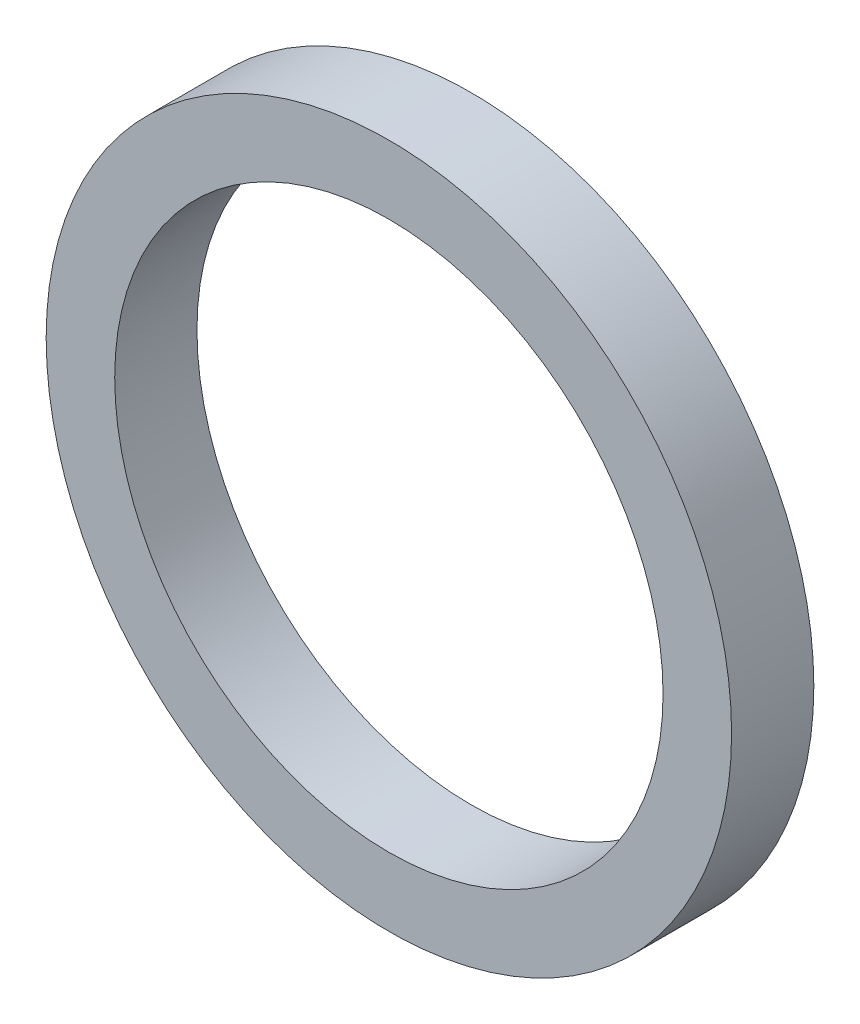
ISO-10303-21;
HEADER;
FILE_DESCRIPTION(('STEP AP214'),'2;1');
FILE_NAME('part.step','',(''),(''),'','','');
FILE_SCHEMA(('AUTOMOTIVE_DESIGN { 1 0 10303 214 1 1 1 1 }'));
ENDSEC;
DATA;
#1=APPLICATION_CONTEXT('core data for automotive mechanical design processes');
#2=APPLICATION_PROTOCOL_DEFINITION('international standard','automotive_design',2000,#1);
#3=PRODUCT_CONTEXT('',#1,'mechanical');
#4=PRODUCT('Part','Part','',(#3));
#5=PRODUCT_RELATED_PRODUCT_CATEGORY('part','',(#4));
#6=PRODUCT_DEFINITION_FORMATION('','',#4);
#7=PRODUCT_DEFINITION_CONTEXT('part definition',#1,'design');
#8=PRODUCT_DEFINITION('design','',#6,#7);
#9=PRODUCT_DEFINITION_SHAPE('','',#8);
#10=(LENGTH_UNIT() NAMED_UNIT(*) SI_UNIT(.MILLI.,.METRE.));
#11=(NAMED_UNIT(*) PLANE_ANGLE_UNIT() SI_UNIT($,.RADIAN.));
#12=(NAMED_UNIT(*) SI_UNIT($,.STERADIAN.) SOLID_ANGLE_UNIT());
#13=UNCERTAINTY_MEASURE_WITH_UNIT(LENGTH_MEASURE(1.E-05),#10,'distance_accuracy_value','');
#14=(GEOMETRIC_REPRESENTATION_CONTEXT(3) GLOBAL_UNCERTAINTY_ASSIGNED_CONTEXT((#13)) GLOBAL_UNIT_ASSIGNED_CONTEXT((#10,
#11,#12)) REPRESENTATION_CONTEXT('',''));
#15=CARTESIAN_POINT('',(0.,0.,0.));
#16=DIRECTION('',(0.,0.,1.));
#17=DIRECTION('',(1.,0.,0.));
#18=AXIS2_PLACEMENT_3D('',#15,#16,#17);
#19=CARTESIAN_POINT('',(0.,0.,6.));
#20=DIRECTION('',(0.,0.,1.));
#21=DIRECTION('',(1.,0.,0.));
#22=AXIS2_PLACEMENT_3D('',#19,#20,#21);
#23=PLANE('',#22);
#24=CARTESIAN_POINT('',(0.,0.,6.));
#25=DIRECTION('',(0.,0.,1.));
#26=DIRECTION('',(1.,0.,0.));
#27=AXIS2_PLACEMENT_3D('',#24,#25,#26);
#28=CIRCLE('',#27,25.);
#29=CARTESIAN_POINT('',(25.,0.,6.));
#30=VERTEX_POINT('',#29);
#31=EDGE_CURVE('E10',#30,#30,#28,.T.);
#32=ORIENTED_EDGE('',*,*,#31,.T.);
#33=EDGE_LOOP('',(#32));
#34=FACE_BOUND('',#33,.T.);
#35=CARTESIAN_POINT('',(0.,0.,6.));
#36=DIRECTION('',(0.,0.,1.));
#37=DIRECTION('',(1.,0.,0.));
#38=AXIS2_PLACEMENT_3D('',#35,#36,#37);
#39=CIRCLE('',#38,20.);
#40=CARTESIAN_POINT('',(20.,0.,6.));
#41=VERTEX_POINT('',#40);
#42=EDGE_CURVE('E48',#41,#41,#39,.T.);
#43=ORIENTED_EDGE('',*,*,#42,.F.);
#44=EDGE_LOOP('',(#43));
#45=FACE_BOUND('',#44,.T.);
#46=ADVANCED_FACE('F34',(#34,#45),#23,.T.);
#47=CARTESIAN_POINT('',(0.,0.,0.));
#48=DIRECTION('',(0.,0.,1.));
#49=DIRECTION('',(1.,0.,0.));
#50=AXIS2_PLACEMENT_3D('',#47,#48,#49);
#51=PLANE('',#50);
#52=CARTESIAN_POINT('',(0.,0.,0.));
#53=DIRECTION('',(0.,0.,1.));
#54=DIRECTION('',(1.,0.,0.));
#55=AXIS2_PLACEMENT_3D('',#52,#53,#54);
#56=CIRCLE('',#55,25.);
#57=CARTESIAN_POINT('',(25.,0.,0.));
#58=VERTEX_POINT('',#57);
#59=EDGE_CURVE('E38',#58,#58,#56,.T.);
#60=ORIENTED_EDGE('',*,*,#59,.F.);
#61=EDGE_LOOP('',(#60));
#62=FACE_BOUND('',#61,.T.);
#63=CARTESIAN_POINT('',(0.,0.,0.));
#64=DIRECTION('',(0.,0.,1.));
#65=DIRECTION('',(1.,0.,0.));
#66=AXIS2_PLACEMENT_3D('',#63,#64,#65);
#67=CIRCLE('',#66,20.);
#68=CARTESIAN_POINT('',(20.,0.,0.));
#69=VERTEX_POINT('',#68);
#70=EDGE_CURVE('E50',#69,#69,#67,.T.);
#71=ORIENTED_EDGE('',*,*,#70,.T.);
#72=EDGE_LOOP('',(#71));
#73=FACE_BOUND('',#72,.T.);
#74=ADVANCED_FACE('F61',(#62,#73),#51,.F.);
#75=CARTESIAN_POINT('',(0.,0.,6.));
#76=DIRECTION('',(0.,0.,-1.));
#77=DIRECTION('',(-1.,0.,0.));
#78=AXIS2_PLACEMENT_3D('',#75,#76,#77);
#79=CYLINDRICAL_SURFACE('',#78,25.);
#80=ORIENTED_EDGE('',*,*,#31,.F.);
#81=EDGE_LOOP('',(#80));
#82=FACE_BOUND('',#81,.T.);
#83=ORIENTED_EDGE('',*,*,#59,.T.);
#84=EDGE_LOOP('',(#83));
#85=FACE_BOUND('',#84,.T.);
#86=ADVANCED_FACE('F36',(#82,#85),#79,.T.);
#87=CARTESIAN_POINT('',(0.,0.,6.));
#88=DIRECTION('',(0.,0.,-1.));
#89=DIRECTION('',(-1.,0.,0.));
#90=AXIS2_PLACEMENT_3D('',#87,#88,#89);
#91=CYLINDRICAL_SURFACE('',#90,20.);
#92=ORIENTED_EDGE('',*,*,#42,.T.);
#93=EDGE_LOOP('',(#92));
#94=FACE_BOUND('',#93,.T.);
#95=ORIENTED_EDGE('',*,*,#70,.F.);
#96=EDGE_LOOP('',(#95));
#97=FACE_BOUND('',#96,.T.);
#98=ADVANCED_FACE('F57',(#94,#97),#91,.F.);
#99=CLOSED_SHELL('',(#46,#74,#86,#98));
#100=MANIFOLD_SOLID_BREP('B2',#99);
#101=ADVANCED_BREP_SHAPE_REPRESENTATION('',(#18,#100),#14);
#102=SHAPE_DEFINITION_REPRESENTATION(#9,#101);
ENDSEC;
END-ISO-10303-21;
